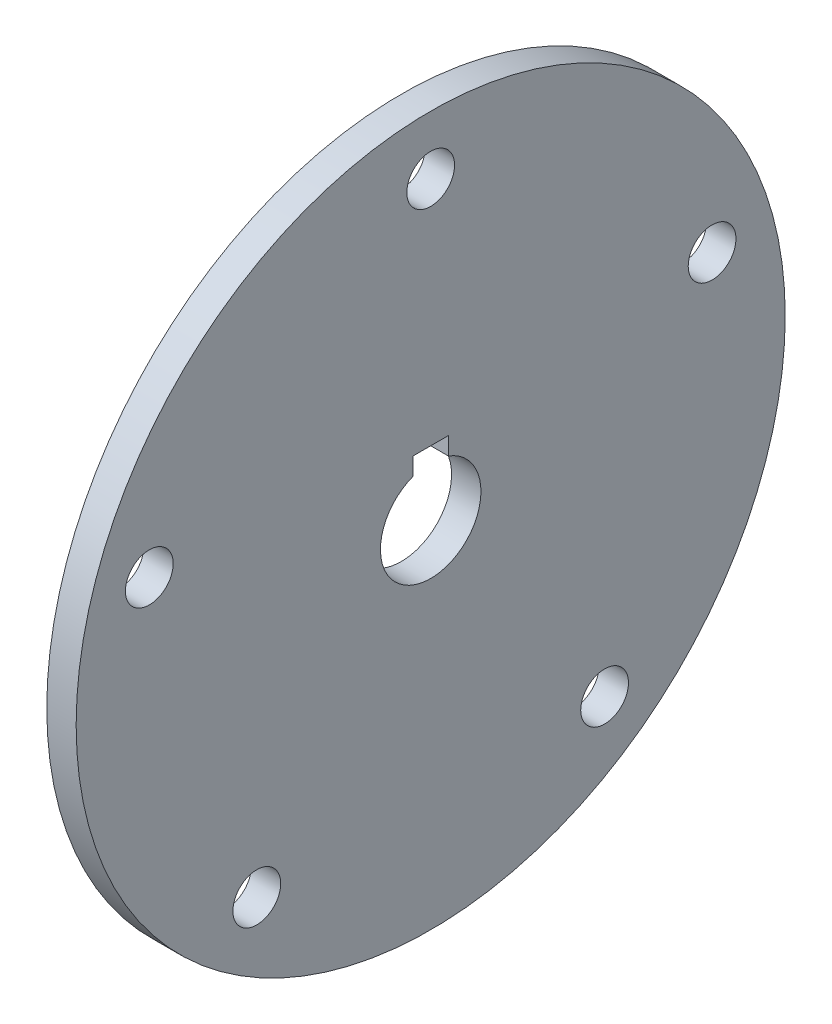
ISO-10303-21;
HEADER;
FILE_DESCRIPTION(('STEP AP214'),'2;1');
FILE_NAME('part.step','',(''),(''),'','','');
FILE_SCHEMA(('AUTOMOTIVE_DESIGN { 1 0 10303 214 1 1 1 1 }'));
ENDSEC;
DATA;
#1=APPLICATION_CONTEXT('core data for automotive mechanical design processes');
#2=APPLICATION_PROTOCOL_DEFINITION('international standard','automotive_design',2000,#1);
#3=PRODUCT_CONTEXT('',#1,'mechanical');
#4=PRODUCT('Part','Part','',(#3));
#5=PRODUCT_RELATED_PRODUCT_CATEGORY('part','',(#4));
#6=PRODUCT_DEFINITION_FORMATION('','',#4);
#7=PRODUCT_DEFINITION_CONTEXT('part definition',#1,'design');
#8=PRODUCT_DEFINITION('design','',#6,#7);
#9=PRODUCT_DEFINITION_SHAPE('','',#8);
#10=(LENGTH_UNIT() NAMED_UNIT(*) SI_UNIT(.MILLI.,.METRE.));
#11=(NAMED_UNIT(*) PLANE_ANGLE_UNIT() SI_UNIT($,.RADIAN.));
#12=(NAMED_UNIT(*) SI_UNIT($,.STERADIAN.) SOLID_ANGLE_UNIT());
#13=UNCERTAINTY_MEASURE_WITH_UNIT(LENGTH_MEASURE(1.E-05),#10,'distance_accuracy_value','');
#14=(GEOMETRIC_REPRESENTATION_CONTEXT(3) GLOBAL_UNCERTAINTY_ASSIGNED_CONTEXT((#13)) GLOBAL_UNIT_ASSIGNED_CONTEXT((#10,
#11,#12)) REPRESENTATION_CONTEXT('',''));
#15=CARTESIAN_POINT('',(0.,0.,0.));
#16=DIRECTION('',(0.,0.,1.));
#17=DIRECTION('',(1.,0.,0.));
#18=AXIS2_PLACEMENT_3D('',#15,#16,#17);
#19=CARTESIAN_POINT('',(2.5,0.,0.));
#20=DIRECTION('',(-1.,0.,0.));
#21=DIRECTION('',(0.,0.,1.));
#22=AXIS2_PLACEMENT_3D('',#19,#20,#21);
#23=CYLINDRICAL_SURFACE('',#22,60.325);
#24=CARTESIAN_POINT('',(2.5,0.,0.));
#25=DIRECTION('',(1.,0.,0.));
#26=DIRECTION('',(0.,0.,-1.));
#27=AXIS2_PLACEMENT_3D('',#24,#25,#26);
#28=CIRCLE('',#27,60.325);
#29=CARTESIAN_POINT('',(2.5,0.,-60.325));
#30=VERTEX_POINT('',#29);
#31=EDGE_CURVE('E11',#30,#30,#28,.T.);
#32=ORIENTED_EDGE('',*,*,#31,.F.);
#33=EDGE_LOOP('',(#32));
#34=FACE_BOUND('',#33,.T.);
#35=CARTESIAN_POINT('',(-2.5,0.,0.));
#36=DIRECTION('',(1.,0.,0.));
#37=DIRECTION('',(0.,0.,-1.));
#38=AXIS2_PLACEMENT_3D('',#35,#36,#37);
#39=CIRCLE('',#38,60.325);
#40=CARTESIAN_POINT('',(-2.5,0.,-60.325));
#41=VERTEX_POINT('',#40);
#42=EDGE_CURVE('E47',#41,#41,#39,.T.);
#43=ORIENTED_EDGE('',*,*,#42,.T.);
#44=EDGE_LOOP('',(#43));
#45=FACE_BOUND('',#44,.T.);
#46=ADVANCED_FACE('F44',(#34,#45),#23,.T.);
#47=CARTESIAN_POINT('',(2.5,0.,0.));
#48=DIRECTION('',(1.,0.,0.));
#49=DIRECTION('',(0.,0.,-1.));
#50=AXIS2_PLACEMENT_3D('',#47,#48,#49);
#51=PLANE('',#50);
#52=DIRECTION('',(0.,1.,0.));
#53=VECTOR('',#52,1.);
#54=CARTESIAN_POINT('',(2.5,11.0064036870495,-3.));
#55=LINE('',#54,#53);
#56=CARTESIAN_POINT('',(2.5,8.00640368704951,-3.));
#57=VERTEX_POINT('',#56);
#58=CARTESIAN_POINT('',(2.5,11.0064036870495,-3.));
#59=VERTEX_POINT('',#58);
#60=EDGE_CURVE('E59',#57,#59,#55,.T.);
#61=ORIENTED_EDGE('',*,*,#60,.F.);
#62=CARTESIAN_POINT('',(2.5,0.,0.));
#63=DIRECTION('',(1.,0.,0.));
#64=DIRECTION('',(0.,0.,-1.));
#65=AXIS2_PLACEMENT_3D('',#62,#63,#64);
#66=CIRCLE('',#65,8.55);
#67=CARTESIAN_POINT('',(2.5,8.00640368704951,3.));
#68=VERTEX_POINT('',#67);
#69=EDGE_CURVE('E122',#68,#57,#66,.T.);
#70=ORIENTED_EDGE('',*,*,#69,.F.);
#71=DIRECTION('',(0.,-1.,0.));
#72=VECTOR('',#71,1.);
#73=CARTESIAN_POINT('',(2.5,11.0064036870495,3.));
#74=LINE('',#73,#72);
#75=CARTESIAN_POINT('',(2.5,11.0064036870495,3.));
#76=VERTEX_POINT('',#75);
#77=EDGE_CURVE('E87',#76,#68,#74,.T.);
#78=ORIENTED_EDGE('',*,*,#77,.F.);
#79=DIRECTION('',(0.,0.,1.));
#80=VECTOR('',#79,1.);
#81=CARTESIAN_POINT('',(2.5,11.0064036870495,0.));
#82=LINE('',#81,#80);
#83=EDGE_CURVE('E116',#59,#76,#82,.T.);
#84=ORIENTED_EDGE('',*,*,#83,.F.);
#85=EDGE_LOOP('',(#61,#70,#78,#84));
#86=FACE_BOUND('',#85,.T.);
#87=CARTESIAN_POINT('',(2.5,50.342959834304,0.));
#88=DIRECTION('',(-1.,0.,0.));
#89=DIRECTION('',(0.,0.,1.));
#90=AXIS2_PLACEMENT_3D('',#87,#88,#89);
#91=CIRCLE('',#90,4.064);
#92=CARTESIAN_POINT('',(2.5,50.342959834304,4.064));
#93=VERTEX_POINT('',#92);
#94=EDGE_CURVE('E135',#93,#93,#91,.T.);
#95=ORIENTED_EDGE('',*,*,#94,.T.);
#96=EDGE_LOOP('',(#95));
#97=FACE_BOUND('',#96,.T.);
#98=CARTESIAN_POINT('',(2.5,15.5568301359353,47.879));
#99=DIRECTION('',(-1.,0.,0.));
#100=DIRECTION('',(0.,0.,1.));
#101=AXIS2_PLACEMENT_3D('',#98,#99,#100);
#102=CIRCLE('',#101,4.06400000000012);
#103=CARTESIAN_POINT('',(2.5,15.5568301359353,51.9430000000001));
#104=VERTEX_POINT('',#103);
#105=EDGE_CURVE('E147',#104,#104,#102,.T.);
#106=ORIENTED_EDGE('',*,*,#105,.T.);
#107=EDGE_LOOP('',(#106));
#108=FACE_BOUND('',#107,.T.);
#109=CARTESIAN_POINT('',(2.5,-40.7283100530873,29.5908493473562));
#110=DIRECTION('',(-1.,0.,0.));
#111=DIRECTION('',(0.,0.,1.));
#112=AXIS2_PLACEMENT_3D('',#109,#110,#111);
#113=CIRCLE('',#112,4.064);
#114=CARTESIAN_POINT('',(2.5,-40.7283100530873,33.6548493473562));
#115=VERTEX_POINT('',#114);
#116=EDGE_CURVE('E155',#115,#115,#113,.T.);
#117=ORIENTED_EDGE('',*,*,#116,.T.);
#118=EDGE_LOOP('',(#117));
#119=FACE_BOUND('',#118,.T.);
#120=CARTESIAN_POINT('',(2.5,-40.7283100530873,-29.5908493473563));
#121=DIRECTION('',(-1.,0.,0.));
#122=DIRECTION('',(0.,0.,1.));
#123=AXIS2_PLACEMENT_3D('',#120,#121,#122);
#124=CIRCLE('',#123,4.06400000000001);
#125=CARTESIAN_POINT('',(2.5,-40.7283100530873,-25.5268493473562));
#126=VERTEX_POINT('',#125);
#127=EDGE_CURVE('E163',#126,#126,#124,.T.);
#128=ORIENTED_EDGE('',*,*,#127,.T.);
#129=EDGE_LOOP('',(#128));
#130=FACE_BOUND('',#129,.T.);
#131=CARTESIAN_POINT('',(2.5,15.5568301359353,-47.879));
#132=DIRECTION('',(-1.,0.,0.));
#133=DIRECTION('',(0.,0.,1.));
#134=AXIS2_PLACEMENT_3D('',#131,#132,#133);
#135=CIRCLE('',#134,4.06400000000002);
#136=CARTESIAN_POINT('',(2.5,15.5568301359353,-43.815));
#137=VERTEX_POINT('',#136);
#138=EDGE_CURVE('E130',#137,#137,#135,.T.);
#139=ORIENTED_EDGE('',*,*,#138,.T.);
#140=EDGE_LOOP('',(#139));
#141=FACE_BOUND('',#140,.T.);
#142=ORIENTED_EDGE('',*,*,#31,.T.);
#143=EDGE_LOOP('',(#142));
#144=FACE_BOUND('',#143,.T.);
#145=ADVANCED_FACE('F175',(#86,#97,#108,#119,#130,#141,#144),#51,.T.);
#146=CARTESIAN_POINT('',(-2.5,0.,0.));
#147=DIRECTION('',(1.,0.,0.));
#148=DIRECTION('',(0.,0.,-1.));
#149=AXIS2_PLACEMENT_3D('',#146,#147,#148);
#150=PLANE('',#149);
#151=CARTESIAN_POINT('',(-2.5,0.,0.));
#152=DIRECTION('',(1.,0.,0.));
#153=DIRECTION('',(0.,0.,-1.));
#154=AXIS2_PLACEMENT_3D('',#151,#152,#153);
#155=CIRCLE('',#154,8.55);
#156=CARTESIAN_POINT('',(-2.5,8.00640368704951,3.));
#157=VERTEX_POINT('',#156);
#158=CARTESIAN_POINT('',(-2.5,8.00640368704951,-3.));
#159=VERTEX_POINT('',#158);
#160=EDGE_CURVE('E96',#157,#159,#155,.T.);
#161=ORIENTED_EDGE('',*,*,#160,.T.);
#162=DIRECTION('',(0.,1.,0.));
#163=VECTOR('',#162,1.);
#164=CARTESIAN_POINT('',(-2.5,11.0064036870495,-3.));
#165=LINE('',#164,#163);
#166=CARTESIAN_POINT('',(-2.5,11.0064036870495,-3.));
#167=VERTEX_POINT('',#166);
#168=EDGE_CURVE('E102',#159,#167,#165,.T.);
#169=ORIENTED_EDGE('',*,*,#168,.T.);
#170=DIRECTION('',(0.,0.,1.));
#171=VECTOR('',#170,1.);
#172=CARTESIAN_POINT('',(-2.5,11.0064036870495,0.));
#173=LINE('',#172,#171);
#174=CARTESIAN_POINT('',(-2.5,11.0064036870495,3.));
#175=VERTEX_POINT('',#174);
#176=EDGE_CURVE('E108',#167,#175,#173,.T.);
#177=ORIENTED_EDGE('',*,*,#176,.T.);
#178=DIRECTION('',(0.,-1.,0.));
#179=VECTOR('',#178,1.);
#180=CARTESIAN_POINT('',(-2.5,11.0064036870495,3.));
#181=LINE('',#180,#179);
#182=EDGE_CURVE('E67',#175,#157,#181,.T.);
#183=ORIENTED_EDGE('',*,*,#182,.T.);
#184=EDGE_LOOP('',(#161,#169,#177,#183));
#185=FACE_BOUND('',#184,.T.);
#186=CARTESIAN_POINT('',(-2.5,50.342959834304,0.));
#187=DIRECTION('',(-1.,0.,0.));
#188=DIRECTION('',(0.,0.,1.));
#189=AXIS2_PLACEMENT_3D('',#186,#187,#188);
#190=CIRCLE('',#189,4.064);
#191=CARTESIAN_POINT('',(-2.5,50.342959834304,4.064));
#192=VERTEX_POINT('',#191);
#193=EDGE_CURVE('E139',#192,#192,#190,.T.);
#194=ORIENTED_EDGE('',*,*,#193,.F.);
#195=EDGE_LOOP('',(#194));
#196=FACE_BOUND('',#195,.T.);
#197=CARTESIAN_POINT('',(-2.5,15.5568301359353,47.879));
#198=DIRECTION('',(-1.,0.,0.));
#199=DIRECTION('',(0.,0.,1.));
#200=AXIS2_PLACEMENT_3D('',#197,#198,#199);
#201=CIRCLE('',#200,4.06400000000012);
#202=CARTESIAN_POINT('',(-2.5,15.5568301359353,51.9430000000001));
#203=VERTEX_POINT('',#202);
#204=EDGE_CURVE('E143',#203,#203,#201,.T.);
#205=ORIENTED_EDGE('',*,*,#204,.F.);
#206=EDGE_LOOP('',(#205));
#207=FACE_BOUND('',#206,.T.);
#208=CARTESIAN_POINT('',(-2.5,-40.7283100530873,29.5908493473562));
#209=DIRECTION('',(-1.,0.,0.));
#210=DIRECTION('',(0.,0.,1.));
#211=AXIS2_PLACEMENT_3D('',#208,#209,#210);
#212=CIRCLE('',#211,4.064);
#213=CARTESIAN_POINT('',(-2.5,-40.7283100530873,33.6548493473562));
#214=VERTEX_POINT('',#213);
#215=EDGE_CURVE('E151',#214,#214,#212,.T.);
#216=ORIENTED_EDGE('',*,*,#215,.F.);
#217=EDGE_LOOP('',(#216));
#218=FACE_BOUND('',#217,.T.);
#219=CARTESIAN_POINT('',(-2.5,-40.7283100530873,-29.5908493473563));
#220=DIRECTION('',(-1.,0.,0.));
#221=DIRECTION('',(0.,0.,1.));
#222=AXIS2_PLACEMENT_3D('',#219,#220,#221);
#223=CIRCLE('',#222,4.06400000000001);
#224=CARTESIAN_POINT('',(-2.5,-40.7283100530873,-25.5268493473562));
#225=VERTEX_POINT('',#224);
#226=EDGE_CURVE('E159',#225,#225,#223,.T.);
#227=ORIENTED_EDGE('',*,*,#226,.F.);
#228=EDGE_LOOP('',(#227));
#229=FACE_BOUND('',#228,.T.);
#230=CARTESIAN_POINT('',(-2.5,15.5568301359353,-47.879));
#231=DIRECTION('',(-1.,0.,0.));
#232=DIRECTION('',(0.,0.,1.));
#233=AXIS2_PLACEMENT_3D('',#230,#231,#232);
#234=CIRCLE('',#233,4.06400000000002);
#235=CARTESIAN_POINT('',(-2.5,15.5568301359353,-43.815));
#236=VERTEX_POINT('',#235);
#237=EDGE_CURVE('E167',#236,#236,#234,.T.);
#238=ORIENTED_EDGE('',*,*,#237,.F.);
#239=EDGE_LOOP('',(#238));
#240=FACE_BOUND('',#239,.T.);
#241=ORIENTED_EDGE('',*,*,#42,.F.);
#242=EDGE_LOOP('',(#241));
#243=FACE_BOUND('',#242,.T.);
#244=ADVANCED_FACE('F105',(#185,#196,#207,#218,#229,#240,#243),#150,.F.);
#245=CARTESIAN_POINT('',(2.5,15.5568301359353,-47.879));
#246=DIRECTION('',(-1.,0.,0.));
#247=DIRECTION('',(0.,0.,1.));
#248=AXIS2_PLACEMENT_3D('',#245,#246,#247);
#249=CYLINDRICAL_SURFACE('',#248,4.06400000000002);
#250=ORIENTED_EDGE('',*,*,#138,.F.);
#251=EDGE_LOOP('',(#250));
#252=FACE_BOUND('',#251,.T.);
#253=ORIENTED_EDGE('',*,*,#237,.T.);
#254=EDGE_LOOP('',(#253));
#255=FACE_BOUND('',#254,.T.);
#256=ADVANCED_FACE('F178',(#252,#255),#249,.F.);
#257=CARTESIAN_POINT('',(2.5,-40.7283100530873,-29.5908493473563));
#258=DIRECTION('',(-1.,0.,0.));
#259=DIRECTION('',(0.,0.,1.));
#260=AXIS2_PLACEMENT_3D('',#257,#258,#259);
#261=CYLINDRICAL_SURFACE('',#260,4.06400000000001);
#262=ORIENTED_EDGE('',*,*,#127,.F.);
#263=EDGE_LOOP('',(#262));
#264=FACE_BOUND('',#263,.T.);
#265=ORIENTED_EDGE('',*,*,#226,.T.);
#266=EDGE_LOOP('',(#265));
#267=FACE_BOUND('',#266,.T.);
#268=ADVANCED_FACE('F181',(#264,#267),#261,.F.);
#269=CARTESIAN_POINT('',(2.5,-40.7283100530873,29.5908493473562));
#270=DIRECTION('',(-1.,0.,0.));
#271=DIRECTION('',(0.,0.,1.));
#272=AXIS2_PLACEMENT_3D('',#269,#270,#271);
#273=CYLINDRICAL_SURFACE('',#272,4.064);
#274=ORIENTED_EDGE('',*,*,#116,.F.);
#275=EDGE_LOOP('',(#274));
#276=FACE_BOUND('',#275,.T.);
#277=ORIENTED_EDGE('',*,*,#215,.T.);
#278=EDGE_LOOP('',(#277));
#279=FACE_BOUND('',#278,.T.);
#280=ADVANCED_FACE('F205',(#276,#279),#273,.F.);
#281=CARTESIAN_POINT('',(2.5,15.5568301359353,47.879));
#282=DIRECTION('',(-1.,0.,0.));
#283=DIRECTION('',(0.,0.,1.));
#284=AXIS2_PLACEMENT_3D('',#281,#282,#283);
#285=CYLINDRICAL_SURFACE('',#284,4.06400000000012);
#286=ORIENTED_EDGE('',*,*,#105,.F.);
#287=EDGE_LOOP('',(#286));
#288=FACE_BOUND('',#287,.T.);
#289=ORIENTED_EDGE('',*,*,#204,.T.);
#290=EDGE_LOOP('',(#289));
#291=FACE_BOUND('',#290,.T.);
#292=ADVANCED_FACE('F209',(#288,#291),#285,.F.);
#293=CARTESIAN_POINT('',(2.5,50.342959834304,0.));
#294=DIRECTION('',(-1.,0.,0.));
#295=DIRECTION('',(0.,0.,1.));
#296=AXIS2_PLACEMENT_3D('',#293,#294,#295);
#297=CYLINDRICAL_SURFACE('',#296,4.064);
#298=ORIENTED_EDGE('',*,*,#94,.F.);
#299=EDGE_LOOP('',(#298));
#300=FACE_BOUND('',#299,.T.);
#301=ORIENTED_EDGE('',*,*,#193,.T.);
#302=EDGE_LOOP('',(#301));
#303=FACE_BOUND('',#302,.T.);
#304=ADVANCED_FACE('F213',(#300,#303),#297,.F.);
#305=CARTESIAN_POINT('',(-2.5,11.0064036870495,-3.));
#306=DIRECTION('',(0.,0.,-1.));
#307=DIRECTION('',(0.,1.,0.));
#308=AXIS2_PLACEMENT_3D('',#305,#306,#307);
#309=PLANE('',#308);
#310=ORIENTED_EDGE('',*,*,#60,.T.);
#311=DIRECTION('',(1.,0.,0.));
#312=VECTOR('',#311,1.);
#313=CARTESIAN_POINT('',(-2.5,11.0064036870495,-3.));
#314=LINE('',#313,#312);
#315=EDGE_CURVE('E127',#167,#59,#314,.T.);
#316=ORIENTED_EDGE('',*,*,#315,.F.);
#317=ORIENTED_EDGE('',*,*,#168,.F.);
#318=DIRECTION('',(1.,0.,0.));
#319=VECTOR('',#318,1.);
#320=CARTESIAN_POINT('',(-2.5,8.00640368704951,-3.));
#321=LINE('',#320,#319);
#322=EDGE_CURVE('E92',#159,#57,#321,.T.);
#323=ORIENTED_EDGE('',*,*,#322,.T.);
#324=EDGE_LOOP('',(#310,#316,#317,#323));
#325=FACE_BOUND('',#324,.T.);
#326=ADVANCED_FACE('F217',(#325),#309,.F.);
#327=CARTESIAN_POINT('',(-2.5,0.,0.));
#328=DIRECTION('',(1.,0.,0.));
#329=DIRECTION('',(0.,0.,-1.));
#330=AXIS2_PLACEMENT_3D('',#327,#328,#329);
#331=CYLINDRICAL_SURFACE('',#330,8.55);
#332=ORIENTED_EDGE('',*,*,#69,.T.);
#333=ORIENTED_EDGE('',*,*,#322,.F.);
#334=ORIENTED_EDGE('',*,*,#160,.F.);
#335=DIRECTION('',(1.,0.,0.));
#336=VECTOR('',#335,1.);
#337=CARTESIAN_POINT('',(-2.5,8.00640368704951,3.));
#338=LINE('',#337,#336);
#339=EDGE_CURVE('E83',#157,#68,#338,.T.);
#340=ORIENTED_EDGE('',*,*,#339,.T.);
#341=EDGE_LOOP('',(#332,#333,#334,#340));
#342=FACE_BOUND('',#341,.T.);
#343=ADVANCED_FACE('F97',(#342),#331,.F.);
#344=CARTESIAN_POINT('',(-2.5,11.0064036870495,3.));
#345=DIRECTION('',(0.,0.,1.));
#346=DIRECTION('',(0.,-1.,0.));
#347=AXIS2_PLACEMENT_3D('',#344,#345,#346);
#348=PLANE('',#347);
#349=ORIENTED_EDGE('',*,*,#77,.T.);
#350=ORIENTED_EDGE('',*,*,#339,.F.);
#351=ORIENTED_EDGE('',*,*,#182,.F.);
#352=DIRECTION('',(1.,0.,0.));
#353=VECTOR('',#352,1.);
#354=CARTESIAN_POINT('',(-2.5,11.0064036870495,3.));
#355=LINE('',#354,#353);
#356=EDGE_CURVE('E93',#175,#76,#355,.T.);
#357=ORIENTED_EDGE('',*,*,#356,.T.);
#358=EDGE_LOOP('',(#349,#350,#351,#357));
#359=FACE_BOUND('',#358,.T.);
#360=ADVANCED_FACE('F85',(#359),#348,.F.);
#361=CARTESIAN_POINT('',(-2.5,11.0064036870495,0.));
#362=DIRECTION('',(0.,1.,0.));
#363=DIRECTION('',(0.,0.,1.));
#364=AXIS2_PLACEMENT_3D('',#361,#362,#363);
#365=PLANE('',#364);
#366=ORIENTED_EDGE('',*,*,#83,.T.);
#367=ORIENTED_EDGE('',*,*,#356,.F.);
#368=ORIENTED_EDGE('',*,*,#176,.F.);
#369=ORIENTED_EDGE('',*,*,#315,.T.);
#370=EDGE_LOOP('',(#366,#367,#368,#369));
#371=FACE_BOUND('',#370,.T.);
#372=ADVANCED_FACE('F219',(#371),#365,.F.);
#373=CLOSED_SHELL('',(#46,#145,#244,#256,#268,#280,#292,#304,#326,#343,#360,#372));
#374=MANIFOLD_SOLID_BREP('B2',#373);
#375=ADVANCED_BREP_SHAPE_REPRESENTATION('',(#18,#374),#14);
#376=SHAPE_DEFINITION_REPRESENTATION(#9,#375);
ENDSEC;
END-ISO-10303-21;
